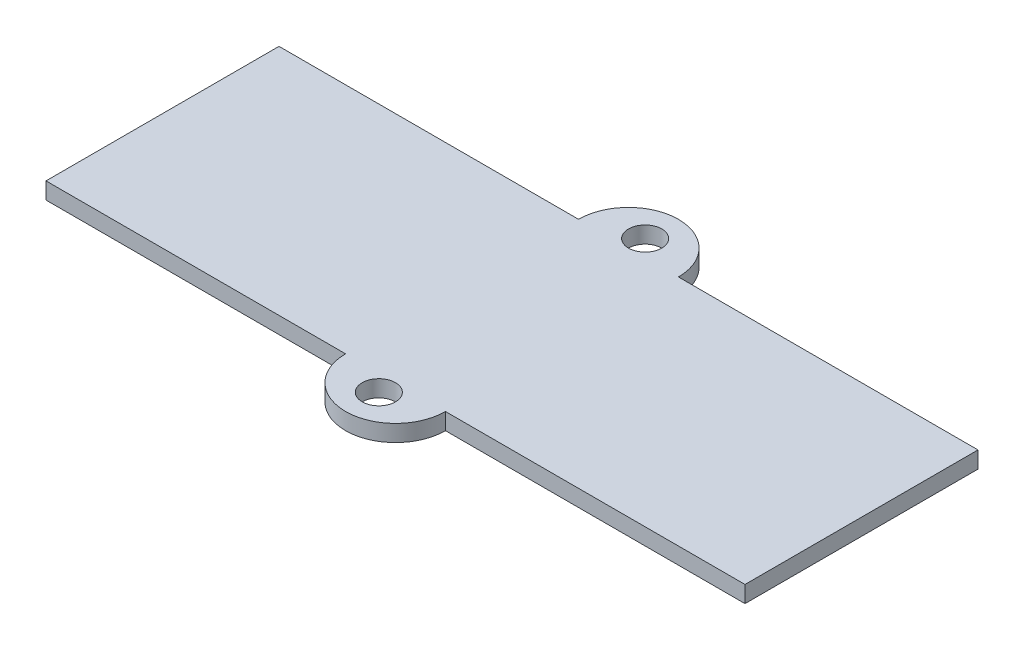
ISO-10303-21;
HEADER;
FILE_DESCRIPTION(('STEP AP214'),'2;1');
FILE_NAME('part.step','',(''),(''),'','','');
FILE_SCHEMA(('AUTOMOTIVE_DESIGN { 1 0 10303 214 1 1 1 1 }'));
ENDSEC;
DATA;
#1=APPLICATION_CONTEXT('core data for automotive mechanical design processes');
#2=APPLICATION_PROTOCOL_DEFINITION('international standard','automotive_design',2000,#1);
#3=PRODUCT_CONTEXT('',#1,'mechanical');
#4=PRODUCT('Part','Part','',(#3));
#5=PRODUCT_RELATED_PRODUCT_CATEGORY('part','',(#4));
#6=PRODUCT_DEFINITION_FORMATION('','',#4);
#7=PRODUCT_DEFINITION_CONTEXT('part definition',#1,'design');
#8=PRODUCT_DEFINITION('design','',#6,#7);
#9=PRODUCT_DEFINITION_SHAPE('','',#8);
#10=(LENGTH_UNIT() NAMED_UNIT(*) SI_UNIT(.MILLI.,.METRE.));
#11=(NAMED_UNIT(*) PLANE_ANGLE_UNIT() SI_UNIT($,.RADIAN.));
#12=(NAMED_UNIT(*) SI_UNIT($,.STERADIAN.) SOLID_ANGLE_UNIT());
#13=UNCERTAINTY_MEASURE_WITH_UNIT(LENGTH_MEASURE(1.E-05),#10,'distance_accuracy_value','');
#14=(GEOMETRIC_REPRESENTATION_CONTEXT(3) GLOBAL_UNCERTAINTY_ASSIGNED_CONTEXT((#13)) GLOBAL_UNIT_ASSIGNED_CONTEXT((#10,
#11,#12)) REPRESENTATION_CONTEXT('',''));
#15=CARTESIAN_POINT('',(0.,0.,0.));
#16=DIRECTION('',(0.,0.,1.));
#17=DIRECTION('',(1.,0.,0.));
#18=AXIS2_PLACEMENT_3D('',#15,#16,#17);
#19=CARTESIAN_POINT('',(123.08278305538,2.,-3.00969407562476));
#20=DIRECTION('',(0.,1.,0.));
#21=DIRECTION('',(0.,0.,1.));
#22=AXIS2_PLACEMENT_3D('',#19,#20,#21);
#23=PLANE('',#22);
#24=CARTESIAN_POINT('',(123.08278305538,2.,-5.00969407562476));
#25=DIRECTION('',(0.,1.,0.));
#26=DIRECTION('',(0.,0.,1.));
#27=AXIS2_PLACEMENT_3D('',#24,#25,#26);
#28=CIRCLE('',#27,2.);
#29=CARTESIAN_POINT('',(123.08278305538,2.,-3.00969407562477));
#30=VERTEX_POINT('',#29);
#31=EDGE_CURVE('E135',#30,#30,#28,.T.);
#32=ORIENTED_EDGE('',*,*,#31,.F.);
#33=EDGE_LOOP('',(#32));
#34=FACE_BOUND('',#33,.T.);
#35=DIRECTION('',(1.,0.,0.));
#36=VECTOR('',#35,1.);
#37=CARTESIAN_POINT('',(129.08278305538,2.,24.9903059243752));
#38=LINE('',#37,#36);
#39=CARTESIAN_POINT('',(129.08278305538,2.,24.9903059243752));
#40=VERTEX_POINT('',#39);
#41=CARTESIAN_POINT('',(165.08278305538,2.,24.9903059243752));
#42=VERTEX_POINT('',#41);
#43=EDGE_CURVE('E146',#40,#42,#38,.T.);
#44=ORIENTED_EDGE('',*,*,#43,.T.);
#45=DIRECTION('',(0.,0.,-1.));
#46=VECTOR('',#45,1.);
#47=CARTESIAN_POINT('',(165.08278305538,2.,24.9903059243752));
#48=LINE('',#47,#46);
#49=CARTESIAN_POINT('',(165.08278305538,2.,-3.00969407562476));
#50=VERTEX_POINT('',#49);
#51=EDGE_CURVE('E94',#42,#50,#48,.T.);
#52=ORIENTED_EDGE('',*,*,#51,.T.);
#53=DIRECTION('',(-1.,0.,0.));
#54=VECTOR('',#53,1.);
#55=CARTESIAN_POINT('',(165.08278305538,2.,-3.00969407562476));
#56=LINE('',#55,#54);
#57=CARTESIAN_POINT('',(129.08278305538,2.,-3.00969407562476));
#58=VERTEX_POINT('',#57);
#59=EDGE_CURVE('E161',#50,#58,#56,.T.);
#60=ORIENTED_EDGE('',*,*,#59,.T.);
#61=CARTESIAN_POINT('',(123.08278305538,2.,-3.00969407562476));
#62=DIRECTION('',(0.,1.,0.));
#63=DIRECTION('',(0.,0.,1.));
#64=AXIS2_PLACEMENT_3D('',#61,#62,#63);
#65=CIRCLE('',#64,6.);
#66=CARTESIAN_POINT('',(117.08278305538,2.,-3.00969407562476));
#67=VERTEX_POINT('',#66);
#68=EDGE_CURVE('E174',#58,#67,#65,.T.);
#69=ORIENTED_EDGE('',*,*,#68,.T.);
#70=DIRECTION('',(-1.,0.,0.));
#71=VECTOR('',#70,1.);
#72=CARTESIAN_POINT('',(117.08278305538,2.,-3.00969407562476));
#73=LINE('',#72,#71);
#74=CARTESIAN_POINT('',(81.0827830553799,2.,-3.00969407562476));
#75=VERTEX_POINT('',#74);
#76=EDGE_CURVE('E113',#67,#75,#73,.T.);
#77=ORIENTED_EDGE('',*,*,#76,.T.);
#78=DIRECTION('',(0.,0.,1.));
#79=VECTOR('',#78,1.);
#80=CARTESIAN_POINT('',(81.0827830553799,2.,-3.00969407562476));
#81=LINE('',#80,#79);
#82=CARTESIAN_POINT('',(81.0827830553799,2.,24.9903059243752));
#83=VERTEX_POINT('',#82);
#84=EDGE_CURVE('E107',#75,#83,#81,.T.);
#85=ORIENTED_EDGE('',*,*,#84,.T.);
#86=DIRECTION('',(1.,0.,0.));
#87=VECTOR('',#86,1.);
#88=CARTESIAN_POINT('',(81.0827830553799,2.,24.9903059243752));
#89=LINE('',#88,#87);
#90=CARTESIAN_POINT('',(117.08278305538,2.,24.9903059243752));
#91=VERTEX_POINT('',#90);
#92=EDGE_CURVE('E111',#83,#91,#89,.T.);
#93=ORIENTED_EDGE('',*,*,#92,.T.);
#94=CARTESIAN_POINT('',(123.08278305538,2.,24.9903059243752));
#95=DIRECTION('',(0.,1.,0.));
#96=DIRECTION('',(0.,0.,1.));
#97=AXIS2_PLACEMENT_3D('',#94,#95,#96);
#98=CIRCLE('',#97,6.00000000000001);
#99=EDGE_CURVE('E51',#91,#40,#98,.T.);
#100=ORIENTED_EDGE('',*,*,#99,.T.);
#101=EDGE_LOOP('',(#44,#52,#60,#69,#77,#85,#93,#100));
#102=FACE_BOUND('',#101,.T.);
#103=CARTESIAN_POINT('',(123.08278305538,2.,26.9903059243752));
#104=DIRECTION('',(0.,1.,0.));
#105=DIRECTION('',(0.,0.,1.));
#106=AXIS2_PLACEMENT_3D('',#103,#104,#105);
#107=CIRCLE('',#106,2.);
#108=CARTESIAN_POINT('',(123.08278305538,2.,28.9903059243752));
#109=VERTEX_POINT('',#108);
#110=EDGE_CURVE('E183',#109,#109,#107,.T.);
#111=ORIENTED_EDGE('',*,*,#110,.F.);
#112=EDGE_LOOP('',(#111));
#113=FACE_BOUND('',#112,.T.);
#114=ADVANCED_FACE('F34',(#34,#102,#113),#23,.T.);
#115=CARTESIAN_POINT('',(123.08278305538,0.,-3.00969407562476));
#116=DIRECTION('',(0.,1.,0.));
#117=DIRECTION('',(0.,0.,1.));
#118=AXIS2_PLACEMENT_3D('',#115,#116,#117);
#119=PLANE('',#118);
#120=DIRECTION('',(1.,0.,0.));
#121=VECTOR('',#120,1.);
#122=CARTESIAN_POINT('',(129.08278305538,0.,24.9903059243752));
#123=LINE('',#122,#121);
#124=CARTESIAN_POINT('',(129.08278305538,0.,24.9903059243752));
#125=VERTEX_POINT('',#124);
#126=CARTESIAN_POINT('',(165.08278305538,0.,24.9903059243752));
#127=VERTEX_POINT('',#126);
#128=EDGE_CURVE('E131',#125,#127,#123,.T.);
#129=ORIENTED_EDGE('',*,*,#128,.F.);
#130=CARTESIAN_POINT('',(123.08278305538,0.,24.9903059243752));
#131=DIRECTION('',(0.,1.,0.));
#132=DIRECTION('',(0.,0.,1.));
#133=AXIS2_PLACEMENT_3D('',#130,#131,#132);
#134=CIRCLE('',#133,6.00000000000001);
#135=CARTESIAN_POINT('',(117.08278305538,0.,24.9903059243752));
#136=VERTEX_POINT('',#135);
#137=EDGE_CURVE('E86',#136,#125,#134,.T.);
#138=ORIENTED_EDGE('',*,*,#137,.F.);
#139=DIRECTION('',(1.,0.,0.));
#140=VECTOR('',#139,1.);
#141=CARTESIAN_POINT('',(81.0827830553799,0.,24.9903059243752));
#142=LINE('',#141,#140);
#143=CARTESIAN_POINT('',(81.0827830553799,0.,24.9903059243752));
#144=VERTEX_POINT('',#143);
#145=EDGE_CURVE('E80',#144,#136,#142,.T.);
#146=ORIENTED_EDGE('',*,*,#145,.F.);
#147=DIRECTION('',(0.,0.,1.));
#148=VECTOR('',#147,1.);
#149=CARTESIAN_POINT('',(81.0827830553799,0.,-3.00969407562476));
#150=LINE('',#149,#148);
#151=CARTESIAN_POINT('',(81.0827830553799,0.,-3.00969407562476));
#152=VERTEX_POINT('',#151);
#153=EDGE_CURVE('E121',#152,#144,#150,.T.);
#154=ORIENTED_EDGE('',*,*,#153,.F.);
#155=DIRECTION('',(-1.,0.,0.));
#156=VECTOR('',#155,1.);
#157=CARTESIAN_POINT('',(117.08278305538,0.,-3.00969407562476));
#158=LINE('',#157,#156);
#159=CARTESIAN_POINT('',(117.08278305538,0.,-3.00969407562476));
#160=VERTEX_POINT('',#159);
#161=EDGE_CURVE('E141',#160,#152,#158,.T.);
#162=ORIENTED_EDGE('',*,*,#161,.F.);
#163=CARTESIAN_POINT('',(123.08278305538,0.,-3.00969407562476));
#164=DIRECTION('',(0.,1.,0.));
#165=DIRECTION('',(0.,0.,1.));
#166=AXIS2_PLACEMENT_3D('',#163,#164,#165);
#167=CIRCLE('',#166,6.);
#168=CARTESIAN_POINT('',(129.08278305538,0.,-3.00969407562476));
#169=VERTEX_POINT('',#168);
#170=EDGE_CURVE('E139',#169,#160,#167,.T.);
#171=ORIENTED_EDGE('',*,*,#170,.F.);
#172=DIRECTION('',(-1.,0.,0.));
#173=VECTOR('',#172,1.);
#174=CARTESIAN_POINT('',(165.08278305538,0.,-3.00969407562476));
#175=LINE('',#174,#173);
#176=CARTESIAN_POINT('',(165.08278305538,0.,-3.00969407562476));
#177=VERTEX_POINT('',#176);
#178=EDGE_CURVE('E137',#177,#169,#175,.T.);
#179=ORIENTED_EDGE('',*,*,#178,.F.);
#180=DIRECTION('',(0.,0.,-1.));
#181=VECTOR('',#180,1.);
#182=CARTESIAN_POINT('',(165.08278305538,0.,24.9903059243752));
#183=LINE('',#182,#181);
#184=EDGE_CURVE('E134',#127,#177,#183,.T.);
#185=ORIENTED_EDGE('',*,*,#184,.F.);
#186=EDGE_LOOP('',(#129,#138,#146,#154,#162,#171,#179,#185));
#187=FACE_BOUND('',#186,.T.);
#188=CARTESIAN_POINT('',(123.08278305538,0.,-5.00969407562476));
#189=DIRECTION('',(0.,1.,0.));
#190=DIRECTION('',(0.,0.,1.));
#191=AXIS2_PLACEMENT_3D('',#188,#189,#190);
#192=CIRCLE('',#191,2.);
#193=CARTESIAN_POINT('',(123.08278305538,0.,-3.00969407562477));
#194=VERTEX_POINT('',#193);
#195=EDGE_CURVE('E180',#194,#194,#192,.T.);
#196=ORIENTED_EDGE('',*,*,#195,.T.);
#197=EDGE_LOOP('',(#196));
#198=FACE_BOUND('',#197,.T.);
#199=CARTESIAN_POINT('',(123.08278305538,0.,26.9903059243752));
#200=DIRECTION('',(0.,1.,0.));
#201=DIRECTION('',(0.,0.,1.));
#202=AXIS2_PLACEMENT_3D('',#199,#200,#201);
#203=CIRCLE('',#202,2.);
#204=CARTESIAN_POINT('',(123.08278305538,0.,28.9903059243752));
#205=VERTEX_POINT('',#204);
#206=EDGE_CURVE('E186',#205,#205,#203,.T.);
#207=ORIENTED_EDGE('',*,*,#206,.T.);
#208=EDGE_LOOP('',(#207));
#209=FACE_BOUND('',#208,.T.);
#210=ADVANCED_FACE('F165',(#187,#198,#209),#119,.F.);
#211=CARTESIAN_POINT('',(129.08278305538,2.,24.9903059243752));
#212=DIRECTION('',(0.,0.,-1.));
#213=DIRECTION('',(-1.,0.,0.));
#214=AXIS2_PLACEMENT_3D('',#211,#212,#213);
#215=PLANE('',#214);
#216=ORIENTED_EDGE('',*,*,#128,.T.);
#217=DIRECTION('',(0.,-1.,0.));
#218=VECTOR('',#217,1.);
#219=CARTESIAN_POINT('',(165.08278305538,2.,24.9903059243752));
#220=LINE('',#219,#218);
#221=EDGE_CURVE('E11',#42,#127,#220,.T.);
#222=ORIENTED_EDGE('',*,*,#221,.F.);
#223=ORIENTED_EDGE('',*,*,#43,.F.);
#224=DIRECTION('',(0.,-1.,0.));
#225=VECTOR('',#224,1.);
#226=CARTESIAN_POINT('',(129.08278305538,2.,24.9903059243752));
#227=LINE('',#226,#225);
#228=EDGE_CURVE('E127',#40,#125,#227,.T.);
#229=ORIENTED_EDGE('',*,*,#228,.T.);
#230=EDGE_LOOP('',(#216,#222,#223,#229));
#231=FACE_BOUND('',#230,.T.);
#232=ADVANCED_FACE('F36',(#231),#215,.F.);
#233=CARTESIAN_POINT('',(165.08278305538,2.,24.9903059243752));
#234=DIRECTION('',(-1.,0.,0.));
#235=DIRECTION('',(0.,0.,1.));
#236=AXIS2_PLACEMENT_3D('',#233,#234,#235);
#237=PLANE('',#236);
#238=ORIENTED_EDGE('',*,*,#184,.T.);
#239=DIRECTION('',(0.,-1.,0.));
#240=VECTOR('',#239,1.);
#241=CARTESIAN_POINT('',(165.08278305538,2.,-3.00969407562476));
#242=LINE('',#241,#240);
#243=EDGE_CURVE('E43',#50,#177,#242,.T.);
#244=ORIENTED_EDGE('',*,*,#243,.F.);
#245=ORIENTED_EDGE('',*,*,#51,.F.);
#246=ORIENTED_EDGE('',*,*,#221,.T.);
#247=EDGE_LOOP('',(#238,#244,#245,#246));
#248=FACE_BOUND('',#247,.T.);
#249=ADVANCED_FACE('F218',(#248),#237,.F.);
#250=CARTESIAN_POINT('',(165.08278305538,2.,-3.00969407562476));
#251=DIRECTION('',(0.,0.,1.));
#252=DIRECTION('',(1.,0.,0.));
#253=AXIS2_PLACEMENT_3D('',#250,#251,#252);
#254=PLANE('',#253);
#255=ORIENTED_EDGE('',*,*,#178,.T.);
#256=DIRECTION('',(0.,-1.,0.));
#257=VECTOR('',#256,1.);
#258=CARTESIAN_POINT('',(129.08278305538,2.,-3.00969407562476));
#259=LINE('',#258,#257);
#260=EDGE_CURVE('E153',#58,#169,#259,.T.);
#261=ORIENTED_EDGE('',*,*,#260,.F.);
#262=ORIENTED_EDGE('',*,*,#59,.F.);
#263=ORIENTED_EDGE('',*,*,#243,.T.);
#264=EDGE_LOOP('',(#255,#261,#262,#263));
#265=FACE_BOUND('',#264,.T.);
#266=ADVANCED_FACE('F159',(#265),#254,.F.);
#267=CARTESIAN_POINT('',(123.08278305538,2.,-3.00969407562476));
#268=DIRECTION('',(0.,-1.,0.));
#269=DIRECTION('',(0.,0.,-1.));
#270=AXIS2_PLACEMENT_3D('',#267,#268,#269);
#271=CYLINDRICAL_SURFACE('',#270,6.);
#272=ORIENTED_EDGE('',*,*,#170,.T.);
#273=DIRECTION('',(0.,-1.,0.));
#274=VECTOR('',#273,1.);
#275=CARTESIAN_POINT('',(117.08278305538,2.,-3.00969407562476));
#276=LINE('',#275,#274);
#277=EDGE_CURVE('E150',#67,#160,#276,.T.);
#278=ORIENTED_EDGE('',*,*,#277,.F.);
#279=ORIENTED_EDGE('',*,*,#68,.F.);
#280=ORIENTED_EDGE('',*,*,#260,.T.);
#281=EDGE_LOOP('',(#272,#278,#279,#280));
#282=FACE_BOUND('',#281,.T.);
#283=ADVANCED_FACE('F170',(#282),#271,.T.);
#284=CARTESIAN_POINT('',(117.08278305538,2.,-3.00969407562476));
#285=DIRECTION('',(0.,0.,1.));
#286=DIRECTION('',(1.,0.,0.));
#287=AXIS2_PLACEMENT_3D('',#284,#285,#286);
#288=PLANE('',#287);
#289=ORIENTED_EDGE('',*,*,#161,.T.);
#290=DIRECTION('',(0.,-1.,0.));
#291=VECTOR('',#290,1.);
#292=CARTESIAN_POINT('',(81.0827830553799,2.,-3.00969407562476));
#293=LINE('',#292,#291);
#294=EDGE_CURVE('E122',#75,#152,#293,.T.);
#295=ORIENTED_EDGE('',*,*,#294,.F.);
#296=ORIENTED_EDGE('',*,*,#76,.F.);
#297=ORIENTED_EDGE('',*,*,#277,.T.);
#298=EDGE_LOOP('',(#289,#295,#296,#297));
#299=FACE_BOUND('',#298,.T.);
#300=ADVANCED_FACE('F173',(#299),#288,.F.);
#301=CARTESIAN_POINT('',(81.0827830553799,2.,-3.00969407562476));
#302=DIRECTION('',(1.,0.,0.));
#303=DIRECTION('',(0.,0.,-1.));
#304=AXIS2_PLACEMENT_3D('',#301,#302,#303);
#305=PLANE('',#304);
#306=ORIENTED_EDGE('',*,*,#153,.T.);
#307=DIRECTION('',(0.,-1.,0.));
#308=VECTOR('',#307,1.);
#309=CARTESIAN_POINT('',(81.0827830553799,2.,24.9903059243752));
#310=LINE('',#309,#308);
#311=EDGE_CURVE('E118',#83,#144,#310,.T.);
#312=ORIENTED_EDGE('',*,*,#311,.F.);
#313=ORIENTED_EDGE('',*,*,#84,.F.);
#314=ORIENTED_EDGE('',*,*,#294,.T.);
#315=EDGE_LOOP('',(#306,#312,#313,#314));
#316=FACE_BOUND('',#315,.T.);
#317=ADVANCED_FACE('F119',(#316),#305,.F.);
#318=CARTESIAN_POINT('',(81.0827830553799,2.,24.9903059243752));
#319=DIRECTION('',(0.,0.,-1.));
#320=DIRECTION('',(-1.,0.,0.));
#321=AXIS2_PLACEMENT_3D('',#318,#319,#320);
#322=PLANE('',#321);
#323=ORIENTED_EDGE('',*,*,#145,.T.);
#324=DIRECTION('',(0.,-1.,0.));
#325=VECTOR('',#324,1.);
#326=CARTESIAN_POINT('',(117.08278305538,2.,24.9903059243752));
#327=LINE('',#326,#325);
#328=EDGE_CURVE('E123',#91,#136,#327,.T.);
#329=ORIENTED_EDGE('',*,*,#328,.F.);
#330=ORIENTED_EDGE('',*,*,#92,.F.);
#331=ORIENTED_EDGE('',*,*,#311,.T.);
#332=EDGE_LOOP('',(#323,#329,#330,#331));
#333=FACE_BOUND('',#332,.T.);
#334=ADVANCED_FACE('F125',(#333),#322,.F.);
#335=CARTESIAN_POINT('',(123.08278305538,2.,24.9903059243752));
#336=DIRECTION('',(0.,-1.,0.));
#337=DIRECTION('',(0.,0.,-1.));
#338=AXIS2_PLACEMENT_3D('',#335,#336,#337);
#339=CYLINDRICAL_SURFACE('',#338,6.00000000000001);
#340=ORIENTED_EDGE('',*,*,#137,.T.);
#341=ORIENTED_EDGE('',*,*,#228,.F.);
#342=ORIENTED_EDGE('',*,*,#99,.F.);
#343=ORIENTED_EDGE('',*,*,#328,.T.);
#344=EDGE_LOOP('',(#340,#341,#342,#343));
#345=FACE_BOUND('',#344,.T.);
#346=ADVANCED_FACE('F206',(#345),#339,.T.);
#347=CARTESIAN_POINT('',(123.08278305538,2.,-5.00969407562476));
#348=DIRECTION('',(0.,-1.,0.));
#349=DIRECTION('',(0.,0.,-1.));
#350=AXIS2_PLACEMENT_3D('',#347,#348,#349);
#351=CYLINDRICAL_SURFACE('',#350,2.);
#352=ORIENTED_EDGE('',*,*,#31,.T.);
#353=EDGE_LOOP('',(#352));
#354=FACE_BOUND('',#353,.T.);
#355=ORIENTED_EDGE('',*,*,#195,.F.);
#356=EDGE_LOOP('',(#355));
#357=FACE_BOUND('',#356,.T.);
#358=ADVANCED_FACE('F203',(#354,#357),#351,.F.);
#359=CARTESIAN_POINT('',(123.08278305538,2.,26.9903059243752));
#360=DIRECTION('',(0.,-1.,0.));
#361=DIRECTION('',(0.,0.,-1.));
#362=AXIS2_PLACEMENT_3D('',#359,#360,#361);
#363=CYLINDRICAL_SURFACE('',#362,2.);
#364=ORIENTED_EDGE('',*,*,#110,.T.);
#365=EDGE_LOOP('',(#364));
#366=FACE_BOUND('',#365,.T.);
#367=ORIENTED_EDGE('',*,*,#206,.F.);
#368=EDGE_LOOP('',(#367));
#369=FACE_BOUND('',#368,.T.);
#370=ADVANCED_FACE('F192',(#366,#369),#363,.F.);
#371=CLOSED_SHELL('',(#114,#210,#232,#249,#266,#283,#300,#317,#334,#346,#358,#370));
#372=MANIFOLD_SOLID_BREP('B2',#371);
#373=ADVANCED_BREP_SHAPE_REPRESENTATION('',(#18,#372),#14);
#374=SHAPE_DEFINITION_REPRESENTATION(#9,#373);
ENDSEC;
END-ISO-10303-21;
